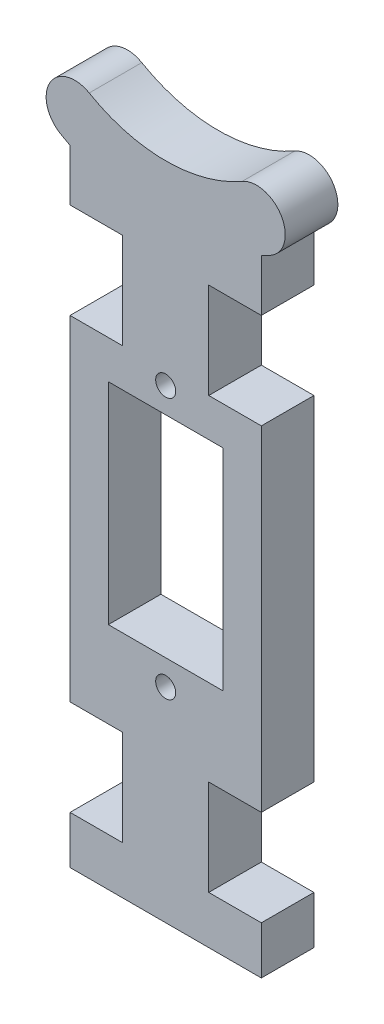
ISO-10303-21;
HEADER;
FILE_DESCRIPTION(('STEP AP214'),'2;1');
FILE_NAME('part.step','',(''),(''),'','','');
FILE_SCHEMA(('AUTOMOTIVE_DESIGN { 1 0 10303 214 1 1 1 1 }'));
ENDSEC;
DATA;
#1=APPLICATION_CONTEXT('core data for automotive mechanical design processes');
#2=APPLICATION_PROTOCOL_DEFINITION('international standard','automotive_design',2000,#1);
#3=PRODUCT_CONTEXT('',#1,'mechanical');
#4=PRODUCT('Part','Part','',(#3));
#5=PRODUCT_RELATED_PRODUCT_CATEGORY('part','',(#4));
#6=PRODUCT_DEFINITION_FORMATION('','',#4);
#7=PRODUCT_DEFINITION_CONTEXT('part definition',#1,'design');
#8=PRODUCT_DEFINITION('design','',#6,#7);
#9=PRODUCT_DEFINITION_SHAPE('','',#8);
#10=(LENGTH_UNIT() NAMED_UNIT(*) SI_UNIT(.MILLI.,.METRE.));
#11=(NAMED_UNIT(*) PLANE_ANGLE_UNIT() SI_UNIT($,.RADIAN.));
#12=(NAMED_UNIT(*) SI_UNIT($,.STERADIAN.) SOLID_ANGLE_UNIT());
#13=UNCERTAINTY_MEASURE_WITH_UNIT(LENGTH_MEASURE(1.E-05),#10,'distance_accuracy_value','');
#14=(GEOMETRIC_REPRESENTATION_CONTEXT(3) GLOBAL_UNCERTAINTY_ASSIGNED_CONTEXT((#13)) GLOBAL_UNIT_ASSIGNED_CONTEXT((#10,
#11,#12)) REPRESENTATION_CONTEXT('',''));
#15=CARTESIAN_POINT('',(0.,0.,0.));
#16=DIRECTION('',(0.,0.,1.));
#17=DIRECTION('',(1.,0.,0.));
#18=AXIS2_PLACEMENT_3D('',#15,#16,#17);
#19=CARTESIAN_POINT('',(-10.,-19.5959179422654,5.5));
#20=DIRECTION('',(1.,0.,0.));
#21=DIRECTION('',(0.,1.,0.));
#22=AXIS2_PLACEMENT_3D('',#19,#20,#21);
#23=PLANE('',#22);
#24=DIRECTION('',(0.,-1.,0.));
#25=VECTOR('',#24,1.);
#26=CARTESIAN_POINT('',(-10.,-19.5959179422654,5.5));
#27=LINE('',#26,#25);
#28=CARTESIAN_POINT('',(-10.,-35.,5.5));
#29=VERTEX_POINT('',#28);
#30=CARTESIAN_POINT('',(-10.,-70.,5.5));
#31=VERTEX_POINT('',#30);
#32=EDGE_CURVE('E322',#29,#31,#27,.T.);
#33=ORIENTED_EDGE('',*,*,#32,.F.);
#34=DIRECTION('',(0.,0.,1.));
#35=VECTOR('',#34,1.);
#36=CARTESIAN_POINT('',(-10.,-35.,0.));
#37=LINE('',#36,#35);
#38=CARTESIAN_POINT('',(-10.,-35.,0.));
#39=VERTEX_POINT('',#38);
#40=EDGE_CURVE('E390',#39,#29,#37,.T.);
#41=ORIENTED_EDGE('',*,*,#40,.F.);
#42=DIRECTION('',(0.,-1.,0.));
#43=VECTOR('',#42,1.);
#44=CARTESIAN_POINT('',(-10.,-19.5959179422654,0.));
#45=LINE('',#44,#43);
#46=CARTESIAN_POINT('',(-10.,-70.,0.));
#47=VERTEX_POINT('',#46);
#48=EDGE_CURVE('E296',#39,#47,#45,.T.);
#49=ORIENTED_EDGE('',*,*,#48,.T.);
#50=DIRECTION('',(0.,0.,1.));
#51=VECTOR('',#50,1.);
#52=CARTESIAN_POINT('',(-10.,-70.,0.));
#53=LINE('',#52,#51);
#54=EDGE_CURVE('E364',#47,#31,#53,.T.);
#55=ORIENTED_EDGE('',*,*,#54,.T.);
#56=EDGE_LOOP('',(#33,#41,#49,#55));
#57=FACE_BOUND('',#56,.T.);
#58=ADVANCED_FACE('F32',(#57),#23,.F.);
#59=CARTESIAN_POINT('',(-10.,-19.5959179422654,0.));
#60=VERTEX_POINT('',#59);
#61=CARTESIAN_POINT('',(-10.,-25.,0.));
#62=VERTEX_POINT('',#61);
#63=EDGE_CURVE('E250',#60,#62,#45,.T.);
#64=ORIENTED_EDGE('',*,*,#63,.T.);
#65=DIRECTION('',(0.,0.,1.));
#66=VECTOR('',#65,1.);
#67=CARTESIAN_POINT('',(-10.,-25.,0.));
#68=LINE('',#67,#66);
#69=CARTESIAN_POINT('',(-10.,-25.,5.5));
#70=VERTEX_POINT('',#69);
#71=EDGE_CURVE('E427',#62,#70,#68,.T.);
#72=ORIENTED_EDGE('',*,*,#71,.T.);
#73=CARTESIAN_POINT('',(-10.,-19.5959179422654,5.5));
#74=VERTEX_POINT('',#73);
#75=EDGE_CURVE('E291',#74,#70,#27,.T.);
#76=ORIENTED_EDGE('',*,*,#75,.F.);
#77=DIRECTION('',(0.,0.,-1.));
#78=VECTOR('',#77,1.);
#79=CARTESIAN_POINT('',(-10.,-19.5959179422654,5.5));
#80=LINE('',#79,#78);
#81=EDGE_CURVE('E40',#74,#60,#80,.T.);
#82=ORIENTED_EDGE('',*,*,#81,.T.);
#83=EDGE_LOOP('',(#64,#72,#76,#82));
#84=FACE_BOUND('',#83,.T.);
#85=ADVANCED_FACE('F288',(#84),#23,.F.);
#86=CARTESIAN_POINT('',(10.,-85.,5.5));
#87=DIRECTION('',(-1.,0.,0.));
#88=DIRECTION('',(0.,-1.,0.));
#89=AXIS2_PLACEMENT_3D('',#86,#87,#88);
#90=PLANE('',#89);
#91=DIRECTION('',(0.,1.,0.));
#92=VECTOR('',#91,1.);
#93=CARTESIAN_POINT('',(10.,-85.,0.));
#94=LINE('',#93,#92);
#95=CARTESIAN_POINT('',(10.,-85.,0.));
#96=VERTEX_POINT('',#95);
#97=CARTESIAN_POINT('',(10.,-80.,0.));
#98=VERTEX_POINT('',#97);
#99=EDGE_CURVE('E248',#96,#98,#94,.T.);
#100=ORIENTED_EDGE('',*,*,#99,.T.);
#101=DIRECTION('',(0.,0.,1.));
#102=VECTOR('',#101,1.);
#103=CARTESIAN_POINT('',(10.,-80.,0.));
#104=LINE('',#103,#102);
#105=CARTESIAN_POINT('',(10.,-80.,5.5));
#106=VERTEX_POINT('',#105);
#107=EDGE_CURVE('E405',#98,#106,#104,.T.);
#108=ORIENTED_EDGE('',*,*,#107,.T.);
#109=DIRECTION('',(0.,1.,0.));
#110=VECTOR('',#109,1.);
#111=CARTESIAN_POINT('',(10.,-85.,5.5));
#112=LINE('',#111,#110);
#113=CARTESIAN_POINT('',(10.,-85.,5.5));
#114=VERTEX_POINT('',#113);
#115=EDGE_CURVE('E315',#114,#106,#112,.T.);
#116=ORIENTED_EDGE('',*,*,#115,.F.);
#117=DIRECTION('',(0.,0.,-1.));
#118=VECTOR('',#117,1.);
#119=CARTESIAN_POINT('',(10.,-85.,5.5));
#120=LINE('',#119,#118);
#121=EDGE_CURVE('E278',#114,#96,#120,.T.);
#122=ORIENTED_EDGE('',*,*,#121,.T.);
#123=EDGE_LOOP('',(#100,#108,#116,#122));
#124=FACE_BOUND('',#123,.T.);
#125=ADVANCED_FACE('F512',(#124),#90,.F.);
#126=CARTESIAN_POINT('',(10.,-70.,5.5));
#127=VERTEX_POINT('',#126);
#128=CARTESIAN_POINT('',(10.,-35.,5.5));
#129=VERTEX_POINT('',#128);
#130=EDGE_CURVE('E318',#127,#129,#112,.T.);
#131=ORIENTED_EDGE('',*,*,#130,.F.);
#132=DIRECTION('',(0.,0.,1.));
#133=VECTOR('',#132,1.);
#134=CARTESIAN_POINT('',(10.,-70.,0.));
#135=LINE('',#134,#133);
#136=CARTESIAN_POINT('',(10.,-70.,0.));
#137=VERTEX_POINT('',#136);
#138=EDGE_CURVE('E398',#137,#127,#135,.T.);
#139=ORIENTED_EDGE('',*,*,#138,.F.);
#140=CARTESIAN_POINT('',(10.,-35.,0.));
#141=VERTEX_POINT('',#140);
#142=EDGE_CURVE('E245',#137,#141,#94,.T.);
#143=ORIENTED_EDGE('',*,*,#142,.T.);
#144=DIRECTION('',(0.,0.,1.));
#145=VECTOR('',#144,1.);
#146=CARTESIAN_POINT('',(10.,-35.,0.));
#147=LINE('',#146,#145);
#148=EDGE_CURVE('E417',#141,#129,#147,.T.);
#149=ORIENTED_EDGE('',*,*,#148,.T.);
#150=EDGE_LOOP('',(#131,#139,#143,#149));
#151=FACE_BOUND('',#150,.T.);
#152=ADVANCED_FACE('F466',(#151),#90,.F.);
#153=CARTESIAN_POINT('',(-9.50000000000002,-16.4544826719043,5.5));
#154=DIRECTION('',(0.,0.,-1.));
#155=DIRECTION('',(-1.,0.,0.));
#156=AXIS2_PLACEMENT_3D('',#153,#154,#155);
#157=CYLINDRICAL_SURFACE('',#156,3.);
#158=CARTESIAN_POINT('',(-9.50000000000002,-16.4544826719043,0.));
#159=DIRECTION('',(0.,0.,1.));
#160=DIRECTION('',(-1.,0.,0.));
#161=AXIS2_PLACEMENT_3D('',#158,#159,#160);
#162=CIRCLE('',#161,3.);
#163=CARTESIAN_POINT('',(-8.00000000000002,-13.856406460551,0.));
#164=VERTEX_POINT('',#163);
#165=CARTESIAN_POINT('',(-11.,-19.0525588832576,0.));
#166=VERTEX_POINT('',#165);
#167=EDGE_CURVE('E305',#164,#166,#162,.T.);
#168=ORIENTED_EDGE('',*,*,#167,.T.);
#169=DIRECTION('',(0.,0.,-1.));
#170=VECTOR('',#169,1.);
#171=CARTESIAN_POINT('',(-11.,-19.0525588832576,5.5));
#172=LINE('',#171,#170);
#173=CARTESIAN_POINT('',(-11.,-19.0525588832576,5.5));
#174=VERTEX_POINT('',#173);
#175=EDGE_CURVE('E11',#174,#166,#172,.T.);
#176=ORIENTED_EDGE('',*,*,#175,.F.);
#177=CARTESIAN_POINT('',(-9.50000000000002,-16.4544826719043,5.5));
#178=DIRECTION('',(0.,0.,1.));
#179=DIRECTION('',(-1.,0.,0.));
#180=AXIS2_PLACEMENT_3D('',#177,#178,#179);
#181=CIRCLE('',#180,3.);
#182=CARTESIAN_POINT('',(-8.00000000000002,-13.856406460551,5.5));
#183=VERTEX_POINT('',#182);
#184=EDGE_CURVE('E266',#183,#174,#181,.T.);
#185=ORIENTED_EDGE('',*,*,#184,.F.);
#186=DIRECTION('',(0.,0.,-1.));
#187=VECTOR('',#186,1.);
#188=CARTESIAN_POINT('',(-8.00000000000002,-13.856406460551,5.5));
#189=LINE('',#188,#187);
#190=EDGE_CURVE('E267',#183,#164,#189,.T.);
#191=ORIENTED_EDGE('',*,*,#190,.T.);
#192=EDGE_LOOP('',(#168,#176,#185,#191));
#193=FACE_BOUND('',#192,.T.);
#194=ADVANCED_FACE('F34',(#193),#157,.T.);
#195=CARTESIAN_POINT('',(0.,0.,5.5));
#196=DIRECTION('',(0.,0.,-1.));
#197=DIRECTION('',(-1.,0.,0.));
#198=AXIS2_PLACEMENT_3D('',#195,#196,#197);
#199=CYLINDRICAL_SURFACE('',#198,22.);
#200=CARTESIAN_POINT('',(0.,0.,0.));
#201=DIRECTION('',(0.,0.,1.));
#202=DIRECTION('',(-1.,0.,0.));
#203=AXIS2_PLACEMENT_3D('',#200,#201,#202);
#204=CIRCLE('',#203,22.);
#205=EDGE_CURVE('E294',#166,#60,#204,.T.);
#206=ORIENTED_EDGE('',*,*,#205,.T.);
#207=ORIENTED_EDGE('',*,*,#81,.F.);
#208=CARTESIAN_POINT('',(0.,0.,5.5));
#209=DIRECTION('',(0.,0.,1.));
#210=DIRECTION('',(-1.,0.,0.));
#211=AXIS2_PLACEMENT_3D('',#208,#209,#210);
#212=CIRCLE('',#211,22.);
#213=EDGE_CURVE('E324',#174,#74,#212,.T.);
#214=ORIENTED_EDGE('',*,*,#213,.F.);
#215=ORIENTED_EDGE('',*,*,#175,.T.);
#216=EDGE_LOOP('',(#206,#207,#214,#215));
#217=FACE_BOUND('',#216,.T.);
#218=ADVANCED_FACE('F487',(#217),#199,.T.);
#219=CARTESIAN_POINT('',(-10.,-80.,5.5));
#220=VERTEX_POINT('',#219);
#221=CARTESIAN_POINT('',(-10.,-85.,5.5));
#222=VERTEX_POINT('',#221);
#223=EDGE_CURVE('E323',#220,#222,#27,.T.);
#224=ORIENTED_EDGE('',*,*,#223,.F.);
#225=DIRECTION('',(0.,0.,1.));
#226=VECTOR('',#225,1.);
#227=CARTESIAN_POINT('',(-10.,-80.,0.));
#228=LINE('',#227,#226);
#229=CARTESIAN_POINT('',(-10.,-80.,0.));
#230=VERTEX_POINT('',#229);
#231=EDGE_CURVE('E372',#230,#220,#228,.T.);
#232=ORIENTED_EDGE('',*,*,#231,.F.);
#233=CARTESIAN_POINT('',(-10.,-85.,0.));
#234=VERTEX_POINT('',#233);
#235=EDGE_CURVE('E298',#230,#234,#45,.T.);
#236=ORIENTED_EDGE('',*,*,#235,.T.);
#237=DIRECTION('',(0.,0.,-1.));
#238=VECTOR('',#237,1.);
#239=CARTESIAN_POINT('',(-10.,-85.,5.5));
#240=LINE('',#239,#238);
#241=EDGE_CURVE('E280',#222,#234,#240,.T.);
#242=ORIENTED_EDGE('',*,*,#241,.F.);
#243=EDGE_LOOP('',(#224,#232,#236,#242));
#244=FACE_BOUND('',#243,.T.);
#245=ADVANCED_FACE('F507',(#244),#23,.F.);
#246=CARTESIAN_POINT('',(-10.,-85.,5.5));
#247=DIRECTION('',(0.,1.,0.));
#248=DIRECTION('',(0.,0.,1.));
#249=AXIS2_PLACEMENT_3D('',#246,#247,#248);
#250=PLANE('',#249);
#251=DIRECTION('',(1.,0.,0.));
#252=VECTOR('',#251,1.);
#253=CARTESIAN_POINT('',(-10.,-85.,0.));
#254=LINE('',#253,#252);
#255=EDGE_CURVE('E246',#234,#96,#254,.T.);
#256=ORIENTED_EDGE('',*,*,#255,.T.);
#257=ORIENTED_EDGE('',*,*,#121,.F.);
#258=DIRECTION('',(1.,0.,0.));
#259=VECTOR('',#258,1.);
#260=CARTESIAN_POINT('',(-10.,-85.,5.5));
#261=LINE('',#260,#259);
#262=EDGE_CURVE('E319',#222,#114,#261,.T.);
#263=ORIENTED_EDGE('',*,*,#262,.F.);
#264=ORIENTED_EDGE('',*,*,#241,.T.);
#265=EDGE_LOOP('',(#256,#257,#263,#264));
#266=FACE_BOUND('',#265,.T.);
#267=ADVANCED_FACE('F510',(#266),#250,.F.);
#268=CARTESIAN_POINT('',(10.,-25.,5.5));
#269=VERTEX_POINT('',#268);
#270=CARTESIAN_POINT('',(10.,-19.5959179422654,5.5));
#271=VERTEX_POINT('',#270);
#272=EDGE_CURVE('E236',#269,#271,#112,.T.);
#273=ORIENTED_EDGE('',*,*,#272,.F.);
#274=DIRECTION('',(0.,0.,1.));
#275=VECTOR('',#274,1.);
#276=CARTESIAN_POINT('',(10.,-25.,0.));
#277=LINE('',#276,#275);
#278=CARTESIAN_POINT('',(10.,-25.,0.));
#279=VERTEX_POINT('',#278);
#280=EDGE_CURVE('E221',#279,#269,#277,.T.);
#281=ORIENTED_EDGE('',*,*,#280,.F.);
#282=CARTESIAN_POINT('',(10.,-19.5959179422654,0.));
#283=VERTEX_POINT('',#282);
#284=EDGE_CURVE('E234',#279,#283,#94,.T.);
#285=ORIENTED_EDGE('',*,*,#284,.T.);
#286=DIRECTION('',(0.,0.,-1.));
#287=VECTOR('',#286,1.);
#288=CARTESIAN_POINT('',(10.,-19.5959179422654,5.5));
#289=LINE('',#288,#287);
#290=EDGE_CURVE('E276',#271,#283,#289,.T.);
#291=ORIENTED_EDGE('',*,*,#290,.F.);
#292=EDGE_LOOP('',(#273,#281,#285,#291));
#293=FACE_BOUND('',#292,.T.);
#294=ADVANCED_FACE('F232',(#293),#90,.F.);
#295=CARTESIAN_POINT('',(0.,0.,5.5));
#296=DIRECTION('',(0.,0.,-1.));
#297=DIRECTION('',(-1.,0.,0.));
#298=AXIS2_PLACEMENT_3D('',#295,#296,#297);
#299=CYLINDRICAL_SURFACE('',#298,22.);
#300=CARTESIAN_POINT('',(0.,0.,0.));
#301=DIRECTION('',(0.,0.,1.));
#302=DIRECTION('',(-1.,0.,0.));
#303=AXIS2_PLACEMENT_3D('',#300,#301,#302);
#304=CIRCLE('',#303,22.);
#305=CARTESIAN_POINT('',(11.,-19.0525588832576,0.));
#306=VERTEX_POINT('',#305);
#307=EDGE_CURVE('E244',#283,#306,#304,.T.);
#308=ORIENTED_EDGE('',*,*,#307,.T.);
#309=DIRECTION('',(0.,0.,-1.));
#310=VECTOR('',#309,1.);
#311=CARTESIAN_POINT('',(11.,-19.0525588832576,5.5));
#312=LINE('',#311,#310);
#313=CARTESIAN_POINT('',(11.,-19.0525588832576,5.5));
#314=VERTEX_POINT('',#313);
#315=EDGE_CURVE('E274',#314,#306,#312,.T.);
#316=ORIENTED_EDGE('',*,*,#315,.F.);
#317=CARTESIAN_POINT('',(0.,0.,5.5));
#318=DIRECTION('',(0.,0.,1.));
#319=DIRECTION('',(-1.,0.,0.));
#320=AXIS2_PLACEMENT_3D('',#317,#318,#319);
#321=CIRCLE('',#320,22.);
#322=EDGE_CURVE('E313',#271,#314,#321,.T.);
#323=ORIENTED_EDGE('',*,*,#322,.F.);
#324=ORIENTED_EDGE('',*,*,#290,.T.);
#325=EDGE_LOOP('',(#308,#316,#323,#324));
#326=FACE_BOUND('',#325,.T.);
#327=ADVANCED_FACE('F474',(#326),#299,.T.);
#328=CARTESIAN_POINT('',(9.50000000000002,-16.4544826719043,5.5));
#329=DIRECTION('',(0.,0.,-1.));
#330=DIRECTION('',(-1.,0.,0.));
#331=AXIS2_PLACEMENT_3D('',#328,#329,#330);
#332=CYLINDRICAL_SURFACE('',#331,3.);
#333=CARTESIAN_POINT('',(9.50000000000002,-16.4544826719043,0.));
#334=DIRECTION('',(0.,0.,1.));
#335=DIRECTION('',(-1.,0.,0.));
#336=AXIS2_PLACEMENT_3D('',#333,#334,#335);
#337=CIRCLE('',#336,3.);
#338=CARTESIAN_POINT('',(8.00000000000001,-13.856406460551,0.));
#339=VERTEX_POINT('',#338);
#340=EDGE_CURVE('E258',#306,#339,#337,.T.);
#341=ORIENTED_EDGE('',*,*,#340,.T.);
#342=DIRECTION('',(0.,0.,-1.));
#343=VECTOR('',#342,1.);
#344=CARTESIAN_POINT('',(8.00000000000001,-13.856406460551,5.5));
#345=LINE('',#344,#343);
#346=CARTESIAN_POINT('',(8.00000000000001,-13.856406460551,5.5));
#347=VERTEX_POINT('',#346);
#348=EDGE_CURVE('E270',#347,#339,#345,.T.);
#349=ORIENTED_EDGE('',*,*,#348,.F.);
#350=CARTESIAN_POINT('',(9.50000000000002,-16.4544826719043,5.5));
#351=DIRECTION('',(0.,0.,1.));
#352=DIRECTION('',(-1.,0.,0.));
#353=AXIS2_PLACEMENT_3D('',#350,#351,#352);
#354=CIRCLE('',#353,3.);
#355=EDGE_CURVE('E311',#314,#347,#354,.T.);
#356=ORIENTED_EDGE('',*,*,#355,.F.);
#357=ORIENTED_EDGE('',*,*,#315,.T.);
#358=EDGE_LOOP('',(#341,#349,#356,#357));
#359=FACE_BOUND('',#358,.T.);
#360=ADVANCED_FACE('F478',(#359),#332,.T.);
#361=CARTESIAN_POINT('',(0.,0.,5.5));
#362=DIRECTION('',(0.,0.,-1.));
#363=DIRECTION('',(-1.,0.,0.));
#364=AXIS2_PLACEMENT_3D('',#361,#362,#363);
#365=CYLINDRICAL_SURFACE('',#364,16.);
#366=CARTESIAN_POINT('',(0.,0.,0.));
#367=DIRECTION('',(0.,0.,-1.));
#368=DIRECTION('',(1.,0.,0.));
#369=AXIS2_PLACEMENT_3D('',#366,#367,#368);
#370=CIRCLE('',#369,16.);
#371=EDGE_CURVE('E262',#339,#164,#370,.T.);
#372=ORIENTED_EDGE('',*,*,#371,.T.);
#373=ORIENTED_EDGE('',*,*,#190,.F.);
#374=CARTESIAN_POINT('',(0.,0.,5.5));
#375=DIRECTION('',(0.,0.,-1.));
#376=DIRECTION('',(1.,0.,0.));
#377=AXIS2_PLACEMENT_3D('',#374,#375,#376);
#378=CIRCLE('',#377,16.);
#379=EDGE_CURVE('E271',#347,#183,#378,.T.);
#380=ORIENTED_EDGE('',*,*,#379,.F.);
#381=ORIENTED_EDGE('',*,*,#348,.T.);
#382=EDGE_LOOP('',(#372,#373,#380,#381));
#383=FACE_BOUND('',#382,.T.);
#384=ADVANCED_FACE('F484',(#383),#365,.F.);
#385=CARTESIAN_POINT('',(-9.50000000000002,-16.4544826719043,5.5));
#386=DIRECTION('',(0.,0.,-1.));
#387=DIRECTION('',(-1.,0.,0.));
#388=AXIS2_PLACEMENT_3D('',#385,#386,#387);
#389=PLANE('',#388);
#390=CARTESIAN_POINT('',(0.,-63.65,5.5));
#391=DIRECTION('',(0.,0.,1.));
#392=DIRECTION('',(1.,0.,0.));
#393=AXIS2_PLACEMENT_3D('',#390,#391,#392);
#394=CIRCLE('',#393,1.04999999999999);
#395=CARTESIAN_POINT('',(1.04999999999999,-63.65,5.5));
#396=VERTEX_POINT('',#395);
#397=EDGE_CURVE('E360',#396,#396,#394,.T.);
#398=ORIENTED_EDGE('',*,*,#397,.F.);
#399=EDGE_LOOP('',(#398));
#400=FACE_BOUND('',#399,.T.);
#401=CARTESIAN_POINT('',(0.,-36.35,5.5));
#402=DIRECTION('',(0.,0.,1.));
#403=DIRECTION('',(1.,0.,0.));
#404=AXIS2_PLACEMENT_3D('',#401,#402,#403);
#405=CIRCLE('',#404,1.05);
#406=CARTESIAN_POINT('',(1.05,-36.35,5.5));
#407=VERTEX_POINT('',#406);
#408=EDGE_CURVE('E367',#407,#407,#405,.T.);
#409=ORIENTED_EDGE('',*,*,#408,.F.);
#410=EDGE_LOOP('',(#409));
#411=FACE_BOUND('',#410,.T.);
#412=DIRECTION('',(-1.,0.,0.));
#413=VECTOR('',#412,1.);
#414=CARTESIAN_POINT('',(-6.,-39.,5.5));
#415=LINE('',#414,#413);
#416=CARTESIAN_POINT('',(6.,-39.,5.5));
#417=VERTEX_POINT('',#416);
#418=CARTESIAN_POINT('',(-6.,-39.,5.5));
#419=VERTEX_POINT('',#418);
#420=EDGE_CURVE('E344',#417,#419,#415,.T.);
#421=ORIENTED_EDGE('',*,*,#420,.F.);
#422=DIRECTION('',(0.,1.,0.));
#423=VECTOR('',#422,1.);
#424=CARTESIAN_POINT('',(6.,-39.,5.5));
#425=LINE('',#424,#423);
#426=CARTESIAN_POINT('',(6.,-61.,5.5));
#427=VERTEX_POINT('',#426);
#428=EDGE_CURVE('E347',#427,#417,#425,.T.);
#429=ORIENTED_EDGE('',*,*,#428,.F.);
#430=DIRECTION('',(1.,0.,0.));
#431=VECTOR('',#430,1.);
#432=CARTESIAN_POINT('',(-6.,-61.,5.5));
#433=LINE('',#432,#431);
#434=CARTESIAN_POINT('',(-6.,-61.,5.5));
#435=VERTEX_POINT('',#434);
#436=EDGE_CURVE('E337',#435,#427,#433,.T.);
#437=ORIENTED_EDGE('',*,*,#436,.F.);
#438=DIRECTION('',(0.,-1.,0.));
#439=VECTOR('',#438,1.);
#440=CARTESIAN_POINT('',(-6.,-39.,5.5));
#441=LINE('',#440,#439);
#442=EDGE_CURVE('E341',#419,#435,#441,.T.);
#443=ORIENTED_EDGE('',*,*,#442,.F.);
#444=EDGE_LOOP('',(#421,#429,#437,#443));
#445=FACE_BOUND('',#444,.T.);
#446=DIRECTION('',(0.,1.,0.));
#447=VECTOR('',#446,1.);
#448=CARTESIAN_POINT('',(-4.50000000000002,-35.,5.5));
#449=LINE('',#448,#447);
#450=CARTESIAN_POINT('',(-4.50000000000002,-35.,5.5));
#451=VERTEX_POINT('',#450);
#452=CARTESIAN_POINT('',(-4.50000000000002,-25.,5.5));
#453=VERTEX_POINT('',#452);
#454=EDGE_CURVE('E433',#451,#453,#449,.T.);
#455=ORIENTED_EDGE('',*,*,#454,.F.);
#456=DIRECTION('',(1.,0.,0.));
#457=VECTOR('',#456,1.);
#458=CARTESIAN_POINT('',(-10.,-35.,5.5));
#459=LINE('',#458,#457);
#460=EDGE_CURVE('E407',#29,#451,#459,.T.);
#461=ORIENTED_EDGE('',*,*,#460,.F.);
#462=ORIENTED_EDGE('',*,*,#32,.T.);
#463=DIRECTION('',(-1.,0.,0.));
#464=VECTOR('',#463,1.);
#465=CARTESIAN_POINT('',(-10.,-70.,5.5));
#466=LINE('',#465,#464);
#467=CARTESIAN_POINT('',(-4.50000000000001,-70.,5.5));
#468=VERTEX_POINT('',#467);
#469=EDGE_CURVE('E381',#468,#31,#466,.T.);
#470=ORIENTED_EDGE('',*,*,#469,.F.);
#471=DIRECTION('',(0.,1.,0.));
#472=VECTOR('',#471,1.);
#473=CARTESIAN_POINT('',(-4.50000000000001,-80.,5.5));
#474=LINE('',#473,#472);
#475=CARTESIAN_POINT('',(-4.50000000000001,-80.,5.5));
#476=VERTEX_POINT('',#475);
#477=EDGE_CURVE('E384',#476,#468,#474,.T.);
#478=ORIENTED_EDGE('',*,*,#477,.F.);
#479=DIRECTION('',(1.,0.,0.));
#480=VECTOR('',#479,1.);
#481=CARTESIAN_POINT('',(-10.,-80.,5.5));
#482=LINE('',#481,#480);
#483=EDGE_CURVE('E387',#220,#476,#482,.T.);
#484=ORIENTED_EDGE('',*,*,#483,.F.);
#485=ORIENTED_EDGE('',*,*,#223,.T.);
#486=ORIENTED_EDGE('',*,*,#262,.T.);
#487=ORIENTED_EDGE('',*,*,#115,.T.);
#488=DIRECTION('',(1.,0.,0.));
#489=VECTOR('',#488,1.);
#490=CARTESIAN_POINT('',(10.,-80.,5.5));
#491=LINE('',#490,#489);
#492=CARTESIAN_POINT('',(4.50000000000003,-80.,5.5));
#493=VERTEX_POINT('',#492);
#494=EDGE_CURVE('E408',#493,#106,#491,.T.);
#495=ORIENTED_EDGE('',*,*,#494,.F.);
#496=DIRECTION('',(0.,-1.,0.));
#497=VECTOR('',#496,1.);
#498=CARTESIAN_POINT('',(4.50000000000003,-80.,5.5));
#499=LINE('',#498,#497);
#500=CARTESIAN_POINT('',(4.50000000000003,-70.,5.5));
#501=VERTEX_POINT('',#500);
#502=EDGE_CURVE('E411',#501,#493,#499,.T.);
#503=ORIENTED_EDGE('',*,*,#502,.F.);
#504=DIRECTION('',(-1.,0.,0.));
#505=VECTOR('',#504,1.);
#506=CARTESIAN_POINT('',(10.,-70.,5.5));
#507=LINE('',#506,#505);
#508=EDGE_CURVE('E414',#127,#501,#507,.T.);
#509=ORIENTED_EDGE('',*,*,#508,.F.);
#510=ORIENTED_EDGE('',*,*,#130,.T.);
#511=DIRECTION('',(1.,0.,0.));
#512=VECTOR('',#511,1.);
#513=CARTESIAN_POINT('',(10.,-35.,5.5));
#514=LINE('',#513,#512);
#515=CARTESIAN_POINT('',(4.50000000000002,-35.,5.5));
#516=VERTEX_POINT('',#515);
#517=EDGE_CURVE('E228',#516,#129,#514,.T.);
#518=ORIENTED_EDGE('',*,*,#517,.F.);
#519=DIRECTION('',(0.,-1.,0.));
#520=VECTOR('',#519,1.);
#521=CARTESIAN_POINT('',(4.50000000000002,-35.,5.5));
#522=LINE('',#521,#520);
#523=CARTESIAN_POINT('',(4.50000000000002,-25.,5.5));
#524=VERTEX_POINT('',#523);
#525=EDGE_CURVE('E448',#524,#516,#522,.T.);
#526=ORIENTED_EDGE('',*,*,#525,.F.);
#527=DIRECTION('',(-1.,0.,0.));
#528=VECTOR('',#527,1.);
#529=CARTESIAN_POINT('',(10.,-25.,5.5));
#530=LINE('',#529,#528);
#531=EDGE_CURVE('E451',#269,#524,#530,.T.);
#532=ORIENTED_EDGE('',*,*,#531,.F.);
#533=ORIENTED_EDGE('',*,*,#272,.T.);
#534=ORIENTED_EDGE('',*,*,#322,.T.);
#535=ORIENTED_EDGE('',*,*,#355,.T.);
#536=ORIENTED_EDGE('',*,*,#379,.T.);
#537=ORIENTED_EDGE('',*,*,#184,.T.);
#538=ORIENTED_EDGE('',*,*,#213,.T.);
#539=ORIENTED_EDGE('',*,*,#75,.T.);
#540=DIRECTION('',(-1.,0.,0.));
#541=VECTOR('',#540,1.);
#542=CARTESIAN_POINT('',(-10.,-25.,5.5));
#543=LINE('',#542,#541);
#544=EDGE_CURVE('E430',#453,#70,#543,.T.);
#545=ORIENTED_EDGE('',*,*,#544,.F.);
#546=EDGE_LOOP('',(#455,#461,#462,#470,#478,#484,#485,#486,#487,#495,#503,#509,#510,#518,#526,
#532,#533,#534,#535,#536,#537,#538,#539,#545));
#547=FACE_BOUND('',#546,.T.);
#548=ADVANCED_FACE('F471',(#400,#411,#445,#547),#389,.F.);
#549=CARTESIAN_POINT('',(-9.50000000000002,-16.4544826719043,0.));
#550=DIRECTION('',(0.,0.,-1.));
#551=DIRECTION('',(-1.,0.,0.));
#552=AXIS2_PLACEMENT_3D('',#549,#550,#551);
#553=PLANE('',#552);
#554=DIRECTION('',(1.,0.,0.));
#555=VECTOR('',#554,1.);
#556=CARTESIAN_POINT('',(-10.,-35.,0.));
#557=LINE('',#556,#555);
#558=CARTESIAN_POINT('',(-4.50000000000002,-35.,0.));
#559=VERTEX_POINT('',#558);
#560=EDGE_CURVE('E432',#39,#559,#557,.T.);
#561=ORIENTED_EDGE('',*,*,#560,.T.);
#562=DIRECTION('',(0.,1.,0.));
#563=VECTOR('',#562,1.);
#564=CARTESIAN_POINT('',(-4.50000000000002,-35.,0.));
#565=LINE('',#564,#563);
#566=CARTESIAN_POINT('',(-4.50000000000002,-25.,0.));
#567=VERTEX_POINT('',#566);
#568=EDGE_CURVE('E439',#559,#567,#565,.T.);
#569=ORIENTED_EDGE('',*,*,#568,.T.);
#570=DIRECTION('',(-1.,0.,0.));
#571=VECTOR('',#570,1.);
#572=CARTESIAN_POINT('',(-10.,-25.,0.));
#573=LINE('',#572,#571);
#574=EDGE_CURVE('E47',#567,#62,#573,.T.);
#575=ORIENTED_EDGE('',*,*,#574,.T.);
#576=ORIENTED_EDGE('',*,*,#63,.F.);
#577=ORIENTED_EDGE('',*,*,#205,.F.);
#578=ORIENTED_EDGE('',*,*,#167,.F.);
#579=ORIENTED_EDGE('',*,*,#371,.F.);
#580=ORIENTED_EDGE('',*,*,#340,.F.);
#581=ORIENTED_EDGE('',*,*,#307,.F.);
#582=ORIENTED_EDGE('',*,*,#284,.F.);
#583=DIRECTION('',(-1.,0.,0.));
#584=VECTOR('',#583,1.);
#585=CARTESIAN_POINT('',(10.,-25.,0.));
#586=LINE('',#585,#584);
#587=CARTESIAN_POINT('',(4.50000000000002,-25.,0.));
#588=VERTEX_POINT('',#587);
#589=EDGE_CURVE('E217',#279,#588,#586,.T.);
#590=ORIENTED_EDGE('',*,*,#589,.T.);
#591=DIRECTION('',(0.,-1.,0.));
#592=VECTOR('',#591,1.);
#593=CARTESIAN_POINT('',(4.50000000000002,-35.,0.));
#594=LINE('',#593,#592);
#595=CARTESIAN_POINT('',(4.50000000000002,-35.,0.));
#596=VERTEX_POINT('',#595);
#597=EDGE_CURVE('E227',#588,#596,#594,.T.);
#598=ORIENTED_EDGE('',*,*,#597,.T.);
#599=DIRECTION('',(1.,0.,0.));
#600=VECTOR('',#599,1.);
#601=CARTESIAN_POINT('',(10.,-35.,0.));
#602=LINE('',#601,#600);
#603=EDGE_CURVE('E237',#596,#141,#602,.T.);
#604=ORIENTED_EDGE('',*,*,#603,.T.);
#605=ORIENTED_EDGE('',*,*,#142,.F.);
#606=DIRECTION('',(-1.,0.,0.));
#607=VECTOR('',#606,1.);
#608=CARTESIAN_POINT('',(10.,-70.,0.));
#609=LINE('',#608,#607);
#610=CARTESIAN_POINT('',(4.50000000000003,-70.,0.));
#611=VERTEX_POINT('',#610);
#612=EDGE_CURVE('E410',#137,#611,#609,.T.);
#613=ORIENTED_EDGE('',*,*,#612,.T.);
#614=DIRECTION('',(0.,-1.,0.));
#615=VECTOR('',#614,1.);
#616=CARTESIAN_POINT('',(4.50000000000003,-80.,0.));
#617=LINE('',#616,#615);
#618=CARTESIAN_POINT('',(4.50000000000003,-80.,0.));
#619=VERTEX_POINT('',#618);
#620=EDGE_CURVE('E55',#611,#619,#617,.T.);
#621=ORIENTED_EDGE('',*,*,#620,.T.);
#622=DIRECTION('',(1.,0.,0.));
#623=VECTOR('',#622,1.);
#624=CARTESIAN_POINT('',(10.,-80.,0.));
#625=LINE('',#624,#623);
#626=EDGE_CURVE('E401',#619,#98,#625,.T.);
#627=ORIENTED_EDGE('',*,*,#626,.T.);
#628=ORIENTED_EDGE('',*,*,#99,.F.);
#629=ORIENTED_EDGE('',*,*,#255,.F.);
#630=ORIENTED_EDGE('',*,*,#235,.F.);
#631=DIRECTION('',(1.,0.,0.));
#632=VECTOR('',#631,1.);
#633=CARTESIAN_POINT('',(-10.,-80.,0.));
#634=LINE('',#633,#632);
#635=CARTESIAN_POINT('',(-4.50000000000001,-80.,0.));
#636=VERTEX_POINT('',#635);
#637=EDGE_CURVE('E383',#230,#636,#634,.T.);
#638=ORIENTED_EDGE('',*,*,#637,.T.);
#639=DIRECTION('',(0.,1.,0.));
#640=VECTOR('',#639,1.);
#641=CARTESIAN_POINT('',(-4.50000000000001,-80.,0.));
#642=LINE('',#641,#640);
#643=CARTESIAN_POINT('',(-4.50000000000001,-70.,0.));
#644=VERTEX_POINT('',#643);
#645=EDGE_CURVE('E393',#636,#644,#642,.T.);
#646=ORIENTED_EDGE('',*,*,#645,.T.);
#647=DIRECTION('',(-1.,0.,0.));
#648=VECTOR('',#647,1.);
#649=CARTESIAN_POINT('',(-10.,-70.,0.));
#650=LINE('',#649,#648);
#651=EDGE_CURVE('E375',#644,#47,#650,.T.);
#652=ORIENTED_EDGE('',*,*,#651,.T.);
#653=ORIENTED_EDGE('',*,*,#48,.F.);
#654=EDGE_LOOP('',(#561,#569,#575,#576,#577,#578,#579,#580,#581,#582,#590,#598,#604,#605,#613,
#621,#627,#628,#629,#630,#638,#646,#652,#653));
#655=FACE_BOUND('',#654,.T.);
#656=CARTESIAN_POINT('',(0.,-63.65,0.));
#657=DIRECTION('',(0.,0.,1.));
#658=DIRECTION('',(1.,0.,0.));
#659=AXIS2_PLACEMENT_3D('',#656,#657,#658);
#660=CIRCLE('',#659,1.04999999999999);
#661=CARTESIAN_POINT('',(1.04999999999999,-63.65,0.));
#662=VERTEX_POINT('',#661);
#663=EDGE_CURVE('E363',#662,#662,#660,.T.);
#664=ORIENTED_EDGE('',*,*,#663,.T.);
#665=EDGE_LOOP('',(#664));
#666=FACE_BOUND('',#665,.T.);
#667=CARTESIAN_POINT('',(0.,-36.35,0.));
#668=DIRECTION('',(0.,0.,1.));
#669=DIRECTION('',(1.,0.,0.));
#670=AXIS2_PLACEMENT_3D('',#667,#668,#669);
#671=CIRCLE('',#670,1.05);
#672=CARTESIAN_POINT('',(1.05,-36.35,0.));
#673=VERTEX_POINT('',#672);
#674=EDGE_CURVE('E349',#673,#673,#671,.T.);
#675=ORIENTED_EDGE('',*,*,#674,.T.);
#676=EDGE_LOOP('',(#675));
#677=FACE_BOUND('',#676,.T.);
#678=DIRECTION('',(0.,1.,0.));
#679=VECTOR('',#678,1.);
#680=CARTESIAN_POINT('',(6.,-39.,0.));
#681=LINE('',#680,#679);
#682=CARTESIAN_POINT('',(6.,-61.,0.));
#683=VERTEX_POINT('',#682);
#684=CARTESIAN_POINT('',(6.,-39.,0.));
#685=VERTEX_POINT('',#684);
#686=EDGE_CURVE('E340',#683,#685,#681,.T.);
#687=ORIENTED_EDGE('',*,*,#686,.T.);
#688=DIRECTION('',(-1.,0.,0.));
#689=VECTOR('',#688,1.);
#690=CARTESIAN_POINT('',(-6.,-39.,0.));
#691=LINE('',#690,#689);
#692=CARTESIAN_POINT('',(-6.,-39.,0.));
#693=VERTEX_POINT('',#692);
#694=EDGE_CURVE('E355',#685,#693,#691,.T.);
#695=ORIENTED_EDGE('',*,*,#694,.T.);
#696=DIRECTION('',(0.,-1.,0.));
#697=VECTOR('',#696,1.);
#698=CARTESIAN_POINT('',(-6.,-39.,0.));
#699=LINE('',#698,#697);
#700=CARTESIAN_POINT('',(-6.,-61.,0.));
#701=VERTEX_POINT('',#700);
#702=EDGE_CURVE('E352',#693,#701,#699,.T.);
#703=ORIENTED_EDGE('',*,*,#702,.T.);
#704=DIRECTION('',(1.,0.,0.));
#705=VECTOR('',#704,1.);
#706=CARTESIAN_POINT('',(-6.,-61.,0.));
#707=LINE('',#706,#705);
#708=EDGE_CURVE('E332',#701,#683,#707,.T.);
#709=ORIENTED_EDGE('',*,*,#708,.T.);
#710=EDGE_LOOP('',(#687,#695,#703,#709));
#711=FACE_BOUND('',#710,.T.);
#712=ADVANCED_FACE('F241',(#655,#666,#677,#711),#553,.T.);
#713=CARTESIAN_POINT('',(6.,-39.,0.));
#714=DIRECTION('',(1.,0.,0.));
#715=DIRECTION('',(0.,1.,0.));
#716=AXIS2_PLACEMENT_3D('',#713,#714,#715);
#717=PLANE('',#716);
#718=ORIENTED_EDGE('',*,*,#428,.T.);
#719=DIRECTION('',(0.,0.,1.));
#720=VECTOR('',#719,1.);
#721=CARTESIAN_POINT('',(6.,-39.,0.));
#722=LINE('',#721,#720);
#723=EDGE_CURVE('E328',#685,#417,#722,.T.);
#724=ORIENTED_EDGE('',*,*,#723,.F.);
#725=ORIENTED_EDGE('',*,*,#686,.F.);
#726=DIRECTION('',(0.,0.,1.));
#727=VECTOR('',#726,1.);
#728=CARTESIAN_POINT('',(6.,-61.,0.));
#729=LINE('',#728,#727);
#730=EDGE_CURVE('E307',#683,#427,#729,.T.);
#731=ORIENTED_EDGE('',*,*,#730,.T.);
#732=EDGE_LOOP('',(#718,#724,#725,#731));
#733=FACE_BOUND('',#732,.T.);
#734=ADVANCED_FACE('F575',(#733),#717,.F.);
#735=CARTESIAN_POINT('',(-6.,-61.,0.));
#736=DIRECTION('',(0.,-1.,0.));
#737=DIRECTION('',(0.,0.,-1.));
#738=AXIS2_PLACEMENT_3D('',#735,#736,#737);
#739=PLANE('',#738);
#740=ORIENTED_EDGE('',*,*,#436,.T.);
#741=ORIENTED_EDGE('',*,*,#730,.F.);
#742=ORIENTED_EDGE('',*,*,#708,.F.);
#743=DIRECTION('',(0.,0.,1.));
#744=VECTOR('',#743,1.);
#745=CARTESIAN_POINT('',(-6.,-61.,0.));
#746=LINE('',#745,#744);
#747=EDGE_CURVE('E334',#701,#435,#746,.T.);
#748=ORIENTED_EDGE('',*,*,#747,.T.);
#749=EDGE_LOOP('',(#740,#741,#742,#748));
#750=FACE_BOUND('',#749,.T.);
#751=ADVANCED_FACE('F581',(#750),#739,.F.);
#752=CARTESIAN_POINT('',(-6.,-39.,0.));
#753=DIRECTION('',(-1.,0.,0.));
#754=DIRECTION('',(0.,-1.,0.));
#755=AXIS2_PLACEMENT_3D('',#752,#753,#754);
#756=PLANE('',#755);
#757=ORIENTED_EDGE('',*,*,#442,.T.);
#758=ORIENTED_EDGE('',*,*,#747,.F.);
#759=ORIENTED_EDGE('',*,*,#702,.F.);
#760=DIRECTION('',(0.,0.,1.));
#761=VECTOR('',#760,1.);
#762=CARTESIAN_POINT('',(-6.,-39.,0.));
#763=LINE('',#762,#761);
#764=EDGE_CURVE('E331',#693,#419,#763,.T.);
#765=ORIENTED_EDGE('',*,*,#764,.T.);
#766=EDGE_LOOP('',(#757,#758,#759,#765));
#767=FACE_BOUND('',#766,.T.);
#768=ADVANCED_FACE('F586',(#767),#756,.F.);
#769=CARTESIAN_POINT('',(-6.,-39.,0.));
#770=DIRECTION('',(0.,1.,0.));
#771=DIRECTION('',(0.,0.,1.));
#772=AXIS2_PLACEMENT_3D('',#769,#770,#771);
#773=PLANE('',#772);
#774=ORIENTED_EDGE('',*,*,#420,.T.);
#775=ORIENTED_EDGE('',*,*,#764,.F.);
#776=ORIENTED_EDGE('',*,*,#694,.F.);
#777=ORIENTED_EDGE('',*,*,#723,.T.);
#778=EDGE_LOOP('',(#774,#775,#776,#777));
#779=FACE_BOUND('',#778,.T.);
#780=ADVANCED_FACE('F583',(#779),#773,.F.);
#781=CARTESIAN_POINT('',(0.,-36.35,0.));
#782=DIRECTION('',(0.,0.,1.));
#783=DIRECTION('',(1.,0.,0.));
#784=AXIS2_PLACEMENT_3D('',#781,#782,#783);
#785=CYLINDRICAL_SURFACE('',#784,1.05);
#786=ORIENTED_EDGE('',*,*,#674,.F.);
#787=EDGE_LOOP('',(#786));
#788=FACE_BOUND('',#787,.T.);
#789=ORIENTED_EDGE('',*,*,#408,.T.);
#790=EDGE_LOOP('',(#789));
#791=FACE_BOUND('',#790,.T.);
#792=ADVANCED_FACE('F536',(#788,#791),#785,.F.);
#793=CARTESIAN_POINT('',(0.,-63.65,0.));
#794=DIRECTION('',(0.,0.,1.));
#795=DIRECTION('',(1.,0.,0.));
#796=AXIS2_PLACEMENT_3D('',#793,#794,#795);
#797=CYLINDRICAL_SURFACE('',#796,1.04999999999999);
#798=ORIENTED_EDGE('',*,*,#663,.F.);
#799=EDGE_LOOP('',(#798));
#800=FACE_BOUND('',#799,.T.);
#801=ORIENTED_EDGE('',*,*,#397,.T.);
#802=EDGE_LOOP('',(#801));
#803=FACE_BOUND('',#802,.T.);
#804=ADVANCED_FACE('F529',(#800,#803),#797,.F.);
#805=CARTESIAN_POINT('',(-10.,-70.,0.));
#806=DIRECTION('',(0.,1.,0.));
#807=DIRECTION('',(0.,0.,1.));
#808=AXIS2_PLACEMENT_3D('',#805,#806,#807);
#809=PLANE('',#808);
#810=ORIENTED_EDGE('',*,*,#469,.T.);
#811=ORIENTED_EDGE('',*,*,#54,.F.);
#812=ORIENTED_EDGE('',*,*,#651,.F.);
#813=DIRECTION('',(0.,0.,1.));
#814=VECTOR('',#813,1.);
#815=CARTESIAN_POINT('',(-4.50000000000001,-70.,0.));
#816=LINE('',#815,#814);
#817=EDGE_CURVE('E377',#644,#468,#816,.T.);
#818=ORIENTED_EDGE('',*,*,#817,.T.);
#819=EDGE_LOOP('',(#810,#811,#812,#818));
#820=FACE_BOUND('',#819,.T.);
#821=ADVANCED_FACE('F527',(#820),#809,.F.);
#822=CARTESIAN_POINT('',(-4.50000000000001,-80.,0.));
#823=DIRECTION('',(1.,0.,0.));
#824=DIRECTION('',(0.,0.,-1.));
#825=AXIS2_PLACEMENT_3D('',#822,#823,#824);
#826=PLANE('',#825);
#827=ORIENTED_EDGE('',*,*,#477,.T.);
#828=ORIENTED_EDGE('',*,*,#817,.F.);
#829=ORIENTED_EDGE('',*,*,#645,.F.);
#830=DIRECTION('',(0.,0.,1.));
#831=VECTOR('',#830,1.);
#832=CARTESIAN_POINT('',(-4.50000000000001,-80.,0.));
#833=LINE('',#832,#831);
#834=EDGE_CURVE('E374',#636,#476,#833,.T.);
#835=ORIENTED_EDGE('',*,*,#834,.T.);
#836=EDGE_LOOP('',(#827,#828,#829,#835));
#837=FACE_BOUND('',#836,.T.);
#838=ADVANCED_FACE('F524',(#837),#826,.F.);
#839=CARTESIAN_POINT('',(-10.,-80.,0.));
#840=DIRECTION('',(0.,-1.,0.));
#841=DIRECTION('',(0.,0.,-1.));
#842=AXIS2_PLACEMENT_3D('',#839,#840,#841);
#843=PLANE('',#842);
#844=ORIENTED_EDGE('',*,*,#483,.T.);
#845=ORIENTED_EDGE('',*,*,#834,.F.);
#846=ORIENTED_EDGE('',*,*,#637,.F.);
#847=ORIENTED_EDGE('',*,*,#231,.T.);
#848=EDGE_LOOP('',(#844,#845,#846,#847));
#849=FACE_BOUND('',#848,.T.);
#850=ADVANCED_FACE('F522',(#849),#843,.F.);
#851=CARTESIAN_POINT('',(10.,-35.,0.));
#852=DIRECTION('',(0.,-1.,0.));
#853=DIRECTION('',(0.,0.,-1.));
#854=AXIS2_PLACEMENT_3D('',#851,#852,#853);
#855=PLANE('',#854);
#856=ORIENTED_EDGE('',*,*,#517,.T.);
#857=ORIENTED_EDGE('',*,*,#148,.F.);
#858=ORIENTED_EDGE('',*,*,#603,.F.);
#859=DIRECTION('',(0.,0.,1.));
#860=VECTOR('',#859,1.);
#861=CARTESIAN_POINT('',(4.50000000000002,-35.,0.));
#862=LINE('',#861,#860);
#863=EDGE_CURVE('E443',#596,#516,#862,.T.);
#864=ORIENTED_EDGE('',*,*,#863,.T.);
#865=EDGE_LOOP('',(#856,#857,#858,#864));
#866=FACE_BOUND('',#865,.T.);
#867=ADVANCED_FACE('F462',(#866),#855,.F.);
#868=CARTESIAN_POINT('',(4.50000000000002,-35.,0.));
#869=DIRECTION('',(-1.,0.,0.));
#870=DIRECTION('',(0.,-1.,0.));
#871=AXIS2_PLACEMENT_3D('',#868,#869,#870);
#872=PLANE('',#871);
#873=ORIENTED_EDGE('',*,*,#525,.T.);
#874=ORIENTED_EDGE('',*,*,#863,.F.);
#875=ORIENTED_EDGE('',*,*,#597,.F.);
#876=DIRECTION('',(0.,0.,1.));
#877=VECTOR('',#876,1.);
#878=CARTESIAN_POINT('',(4.50000000000002,-25.,0.));
#879=LINE('',#878,#877);
#880=EDGE_CURVE('E223',#588,#524,#879,.T.);
#881=ORIENTED_EDGE('',*,*,#880,.T.);
#882=EDGE_LOOP('',(#873,#874,#875,#881));
#883=FACE_BOUND('',#882,.T.);
#884=ADVANCED_FACE('F458',(#883),#872,.F.);
#885=CARTESIAN_POINT('',(10.,-25.,0.));
#886=DIRECTION('',(0.,1.,0.));
#887=DIRECTION('',(-1.,0.,0.));
#888=AXIS2_PLACEMENT_3D('',#885,#886,#887);
#889=PLANE('',#888);
#890=ORIENTED_EDGE('',*,*,#531,.T.);
#891=ORIENTED_EDGE('',*,*,#880,.F.);
#892=ORIENTED_EDGE('',*,*,#589,.F.);
#893=ORIENTED_EDGE('',*,*,#280,.T.);
#894=EDGE_LOOP('',(#890,#891,#892,#893));
#895=FACE_BOUND('',#894,.T.);
#896=ADVANCED_FACE('F220',(#895),#889,.F.);
#897=CARTESIAN_POINT('',(10.,-80.,0.));
#898=DIRECTION('',(0.,-1.,0.));
#899=DIRECTION('',(0.,0.,-1.));
#900=AXIS2_PLACEMENT_3D('',#897,#898,#899);
#901=PLANE('',#900);
#902=ORIENTED_EDGE('',*,*,#494,.T.);
#903=ORIENTED_EDGE('',*,*,#107,.F.);
#904=ORIENTED_EDGE('',*,*,#626,.F.);
#905=DIRECTION('',(0.,0.,1.));
#906=VECTOR('',#905,1.);
#907=CARTESIAN_POINT('',(4.50000000000003,-80.,0.));
#908=LINE('',#907,#906);
#909=EDGE_CURVE('E403',#619,#493,#908,.T.);
#910=ORIENTED_EDGE('',*,*,#909,.T.);
#911=EDGE_LOOP('',(#902,#903,#904,#910));
#912=FACE_BOUND('',#911,.T.);
#913=ADVANCED_FACE('F515',(#912),#901,.F.);
#914=CARTESIAN_POINT('',(4.50000000000003,-80.,0.));
#915=DIRECTION('',(-1.,0.,0.));
#916=DIRECTION('',(0.,-1.,0.));
#917=AXIS2_PLACEMENT_3D('',#914,#915,#916);
#918=PLANE('',#917);
#919=ORIENTED_EDGE('',*,*,#502,.T.);
#920=ORIENTED_EDGE('',*,*,#909,.F.);
#921=ORIENTED_EDGE('',*,*,#620,.F.);
#922=DIRECTION('',(0.,0.,1.));
#923=VECTOR('',#922,1.);
#924=CARTESIAN_POINT('',(4.50000000000003,-70.,0.));
#925=LINE('',#924,#923);
#926=EDGE_CURVE('E400',#611,#501,#925,.T.);
#927=ORIENTED_EDGE('',*,*,#926,.T.);
#928=EDGE_LOOP('',(#919,#920,#921,#927));
#929=FACE_BOUND('',#928,.T.);
#930=ADVANCED_FACE('F517',(#929),#918,.F.);
#931=CARTESIAN_POINT('',(10.,-70.,0.));
#932=DIRECTION('',(0.,1.,0.));
#933=DIRECTION('',(0.,0.,1.));
#934=AXIS2_PLACEMENT_3D('',#931,#932,#933);
#935=PLANE('',#934);
#936=ORIENTED_EDGE('',*,*,#508,.T.);
#937=ORIENTED_EDGE('',*,*,#926,.F.);
#938=ORIENTED_EDGE('',*,*,#612,.F.);
#939=ORIENTED_EDGE('',*,*,#138,.T.);
#940=EDGE_LOOP('',(#936,#937,#938,#939));
#941=FACE_BOUND('',#940,.T.);
#942=ADVANCED_FACE('F519',(#941),#935,.F.);
#943=CARTESIAN_POINT('',(-10.,-35.,0.));
#944=DIRECTION('',(0.,-1.,0.));
#945=DIRECTION('',(0.,0.,-1.));
#946=AXIS2_PLACEMENT_3D('',#943,#944,#945);
#947=PLANE('',#946);
#948=ORIENTED_EDGE('',*,*,#460,.T.);
#949=DIRECTION('',(0.,0.,1.));
#950=VECTOR('',#949,1.);
#951=CARTESIAN_POINT('',(-4.50000000000002,-35.,0.));
#952=LINE('',#951,#950);
#953=EDGE_CURVE('E423',#559,#451,#952,.T.);
#954=ORIENTED_EDGE('',*,*,#953,.F.);
#955=ORIENTED_EDGE('',*,*,#560,.F.);
#956=ORIENTED_EDGE('',*,*,#40,.T.);
#957=EDGE_LOOP('',(#948,#954,#955,#956));
#958=FACE_BOUND('',#957,.T.);
#959=ADVANCED_FACE('F495',(#958),#947,.F.);
#960=CARTESIAN_POINT('',(-10.,-25.,0.));
#961=DIRECTION('',(0.,1.,0.));
#962=DIRECTION('',(0.,0.,1.));
#963=AXIS2_PLACEMENT_3D('',#960,#961,#962);
#964=PLANE('',#963);
#965=ORIENTED_EDGE('',*,*,#544,.T.);
#966=ORIENTED_EDGE('',*,*,#71,.F.);
#967=ORIENTED_EDGE('',*,*,#574,.F.);
#968=DIRECTION('',(0.,0.,1.));
#969=VECTOR('',#968,1.);
#970=CARTESIAN_POINT('',(-4.50000000000002,-25.,0.));
#971=LINE('',#970,#969);
#972=EDGE_CURVE('E425',#567,#453,#971,.T.);
#973=ORIENTED_EDGE('',*,*,#972,.T.);
#974=EDGE_LOOP('',(#965,#966,#967,#973));
#975=FACE_BOUND('',#974,.T.);
#976=ADVANCED_FACE('F490',(#975),#964,.F.);
#977=CARTESIAN_POINT('',(-4.50000000000002,-35.,0.));
#978=DIRECTION('',(1.,0.,0.));
#979=DIRECTION('',(0.,0.,-1.));
#980=AXIS2_PLACEMENT_3D('',#977,#978,#979);
#981=PLANE('',#980);
#982=ORIENTED_EDGE('',*,*,#454,.T.);
#983=ORIENTED_EDGE('',*,*,#972,.F.);
#984=ORIENTED_EDGE('',*,*,#568,.F.);
#985=ORIENTED_EDGE('',*,*,#953,.T.);
#986=EDGE_LOOP('',(#982,#983,#984,#985));
#987=FACE_BOUND('',#986,.T.);
#988=ADVANCED_FACE('F493',(#987),#981,.F.);
#989=CLOSED_SHELL('',(#58,#85,#125,#152,#194,#218,#245,#267,#294,#327,#360,#384,#548,#712,#734,
#751,#768,#780,#792,#804,#821,#838,#850,#867,#884,#896,#913,#930,#942,#959,#976,#988));
#990=MANIFOLD_SOLID_BREP('B2',#989);
#991=ADVANCED_BREP_SHAPE_REPRESENTATION('',(#18,#990),#14);
#992=SHAPE_DEFINITION_REPRESENTATION(#9,#991);
ENDSEC;
END-ISO-10303-21;
